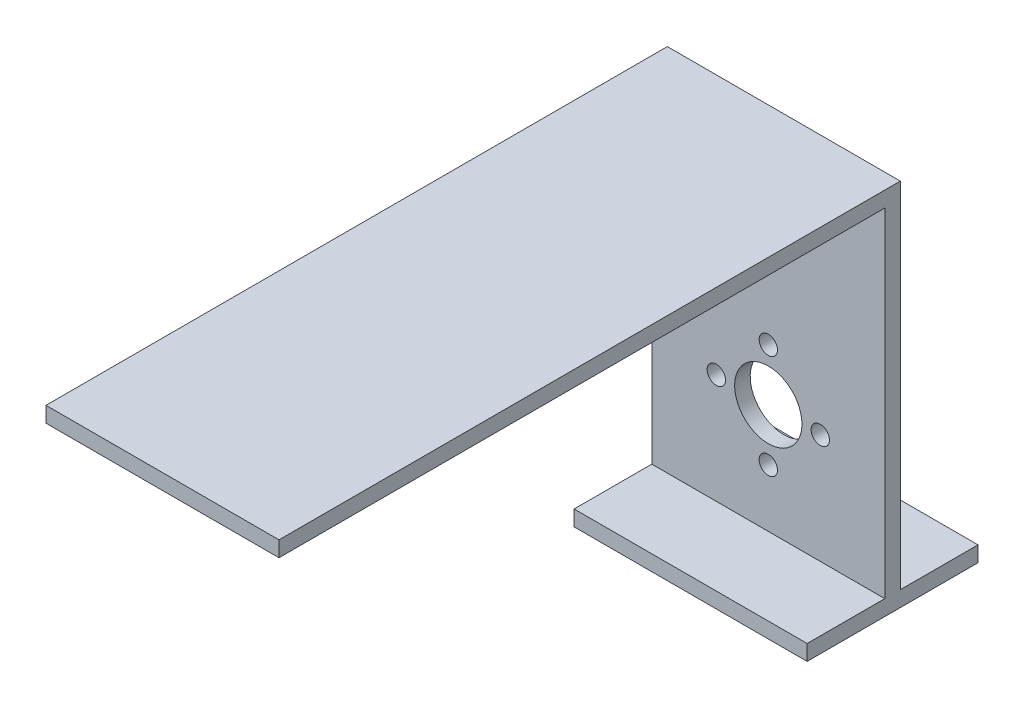
ISO-10303-21;
HEADER;
FILE_DESCRIPTION(('STEP AP214'),'2;1');
FILE_NAME('part.step','',(''),(''),'','','');
FILE_SCHEMA(('AUTOMOTIVE_DESIGN { 1 0 10303 214 1 1 1 1 }'));
ENDSEC;
DATA;
#1=APPLICATION_CONTEXT('core data for automotive mechanical design processes');
#2=APPLICATION_PROTOCOL_DEFINITION('international standard','automotive_design',2000,#1);
#3=PRODUCT_CONTEXT('',#1,'mechanical');
#4=PRODUCT('Part','Part','',(#3));
#5=PRODUCT_RELATED_PRODUCT_CATEGORY('part','',(#4));
#6=PRODUCT_DEFINITION_FORMATION('','',#4);
#7=PRODUCT_DEFINITION_CONTEXT('part definition',#1,'design');
#8=PRODUCT_DEFINITION('design','',#6,#7);
#9=PRODUCT_DEFINITION_SHAPE('','',#8);
#10=(LENGTH_UNIT() NAMED_UNIT(*) SI_UNIT(.MILLI.,.METRE.));
#11=(NAMED_UNIT(*) PLANE_ANGLE_UNIT() SI_UNIT($,.RADIAN.));
#12=(NAMED_UNIT(*) SI_UNIT($,.STERADIAN.) SOLID_ANGLE_UNIT());
#13=UNCERTAINTY_MEASURE_WITH_UNIT(LENGTH_MEASURE(1.E-05),#10,'distance_accuracy_value','');
#14=(GEOMETRIC_REPRESENTATION_CONTEXT(3) GLOBAL_UNCERTAINTY_ASSIGNED_CONTEXT((#13)) GLOBAL_UNIT_ASSIGNED_CONTEXT((#10,
#11,#12)) REPRESENTATION_CONTEXT('',''));
#15=CARTESIAN_POINT('',(0.,0.,0.));
#16=DIRECTION('',(0.,0.,1.));
#17=DIRECTION('',(1.,0.,0.));
#18=AXIS2_PLACEMENT_3D('',#15,#16,#17);
#19=CARTESIAN_POINT('',(38.1,57.86,99.06));
#20=DIRECTION('',(0.,-1.,0.));
#21=DIRECTION('',(0.,0.,-1.));
#22=AXIS2_PLACEMENT_3D('',#19,#20,#21);
#23=PLANE('',#22);
#24=DIRECTION('',(0.,0.,1.));
#25=VECTOR('',#24,1.);
#26=CARTESIAN_POINT('',(0.,57.86,99.06));
#27=LINE('',#26,#25);
#28=CARTESIAN_POINT('',(0.,57.86,-2.53999999999999));
#29=VERTEX_POINT('',#28);
#30=CARTESIAN_POINT('',(0.,57.86,99.06));
#31=VERTEX_POINT('',#30);
#32=EDGE_CURVE('E153',#29,#31,#27,.T.);
#33=ORIENTED_EDGE('',*,*,#32,.T.);
#34=DIRECTION('',(-1.,0.,0.));
#35=VECTOR('',#34,1.);
#36=CARTESIAN_POINT('',(38.1,57.86,99.06));
#37=LINE('',#36,#35);
#38=CARTESIAN_POINT('',(38.1,57.86,99.06));
#39=VERTEX_POINT('',#38);
#40=EDGE_CURVE('E13',#39,#31,#37,.T.);
#41=ORIENTED_EDGE('',*,*,#40,.F.);
#42=DIRECTION('',(0.,0.,1.));
#43=VECTOR('',#42,1.);
#44=CARTESIAN_POINT('',(38.1,57.86,99.06));
#45=LINE('',#44,#43);
#46=CARTESIAN_POINT('',(38.1,57.86,-2.53999999999999));
#47=VERTEX_POINT('',#46);
#48=EDGE_CURVE('E172',#47,#39,#45,.T.);
#49=ORIENTED_EDGE('',*,*,#48,.F.);
#50=DIRECTION('',(-1.,0.,0.));
#51=VECTOR('',#50,1.);
#52=CARTESIAN_POINT('',(38.1,57.86,-2.53999999999999));
#53=LINE('',#52,#51);
#54=EDGE_CURVE('E149',#47,#29,#53,.T.);
#55=ORIENTED_EDGE('',*,*,#54,.T.);
#56=EDGE_LOOP('',(#33,#41,#49,#55));
#57=FACE_BOUND('',#56,.T.);
#58=ADVANCED_FACE('F45',(#57),#23,.F.);
#59=CARTESIAN_POINT('',(38.1,57.86,99.06));
#60=DIRECTION('',(0.,0.,-1.));
#61=DIRECTION('',(0.,1.,0.));
#62=AXIS2_PLACEMENT_3D('',#59,#60,#61);
#63=PLANE('',#62);
#64=DIRECTION('',(0.,-1.,0.));
#65=VECTOR('',#64,1.);
#66=CARTESIAN_POINT('',(0.,57.86,99.06));
#67=LINE('',#66,#65);
#68=CARTESIAN_POINT('',(0.,55.32,99.06));
#69=VERTEX_POINT('',#68);
#70=EDGE_CURVE('E156',#31,#69,#67,.T.);
#71=ORIENTED_EDGE('',*,*,#70,.T.);
#72=DIRECTION('',(-1.,0.,0.));
#73=VECTOR('',#72,1.);
#74=CARTESIAN_POINT('',(38.1,55.32,99.06));
#75=LINE('',#74,#73);
#76=CARTESIAN_POINT('',(38.1,55.32,99.06));
#77=VERTEX_POINT('',#76);
#78=EDGE_CURVE('E53',#77,#69,#75,.T.);
#79=ORIENTED_EDGE('',*,*,#78,.F.);
#80=DIRECTION('',(0.,-1.,0.));
#81=VECTOR('',#80,1.);
#82=CARTESIAN_POINT('',(38.1,57.86,99.06));
#83=LINE('',#82,#81);
#84=EDGE_CURVE('E110',#39,#77,#83,.T.);
#85=ORIENTED_EDGE('',*,*,#84,.F.);
#86=ORIENTED_EDGE('',*,*,#40,.T.);
#87=EDGE_LOOP('',(#71,#79,#85,#86));
#88=FACE_BOUND('',#87,.T.);
#89=ADVANCED_FACE('F284',(#88),#63,.F.);
#90=CARTESIAN_POINT('',(38.1,55.32,99.06));
#91=DIRECTION('',(0.,1.,0.));
#92=DIRECTION('',(0.,0.,1.));
#93=AXIS2_PLACEMENT_3D('',#90,#91,#92);
#94=PLANE('',#93);
#95=DIRECTION('',(0.,0.,-1.));
#96=VECTOR('',#95,1.);
#97=CARTESIAN_POINT('',(0.,55.32,99.06));
#98=LINE('',#97,#96);
#99=CARTESIAN_POINT('',(0.,55.32,0.));
#100=VERTEX_POINT('',#99);
#101=EDGE_CURVE('E159',#69,#100,#98,.T.);
#102=ORIENTED_EDGE('',*,*,#101,.T.);
#103=DIRECTION('',(-1.,0.,0.));
#104=VECTOR('',#103,1.);
#105=CARTESIAN_POINT('',(38.1,55.32,0.));
#106=LINE('',#105,#104);
#107=CARTESIAN_POINT('',(38.1,55.32,0.));
#108=VERTEX_POINT('',#107);
#109=EDGE_CURVE('E185',#108,#100,#106,.T.);
#110=ORIENTED_EDGE('',*,*,#109,.F.);
#111=DIRECTION('',(0.,0.,-1.));
#112=VECTOR('',#111,1.);
#113=CARTESIAN_POINT('',(38.1,55.32,99.06));
#114=LINE('',#113,#112);
#115=EDGE_CURVE('E193',#77,#108,#114,.T.);
#116=ORIENTED_EDGE('',*,*,#115,.F.);
#117=ORIENTED_EDGE('',*,*,#78,.T.);
#118=EDGE_LOOP('',(#102,#110,#116,#117));
#119=FACE_BOUND('',#118,.T.);
#120=ADVANCED_FACE('F191',(#119),#94,.F.);
#121=CARTESIAN_POINT('',(38.1,55.32,0.));
#122=DIRECTION('',(0.,0.,-1.));
#123=DIRECTION('',(-1.,0.,0.));
#124=AXIS2_PLACEMENT_3D('',#121,#122,#123);
#125=PLANE('',#124);
#126=CARTESIAN_POINT('',(19.05,26.42,0.));
#127=DIRECTION('',(0.,0.,1.));
#128=DIRECTION('',(1.,0.,0.));
#129=AXIS2_PLACEMENT_3D('',#126,#127,#128);
#130=CIRCLE('',#129,1.5);
#131=CARTESIAN_POINT('',(20.55,26.42,0.));
#132=VERTEX_POINT('',#131);
#133=EDGE_CURVE('E230',#132,#132,#130,.T.);
#134=ORIENTED_EDGE('',*,*,#133,.F.);
#135=EDGE_LOOP('',(#134));
#136=FACE_BOUND('',#135,.T.);
#137=CARTESIAN_POINT('',(19.05,17.92,0.));
#138=DIRECTION('',(0.,0.,1.));
#139=DIRECTION('',(1.,0.,0.));
#140=AXIS2_PLACEMENT_3D('',#137,#138,#139);
#141=CIRCLE('',#140,5.5);
#142=CARTESIAN_POINT('',(24.55,17.92,0.));
#143=VERTEX_POINT('',#142);
#144=EDGE_CURVE('E237',#143,#143,#141,.T.);
#145=ORIENTED_EDGE('',*,*,#144,.F.);
#146=EDGE_LOOP('',(#145));
#147=FACE_BOUND('',#146,.T.);
#148=CARTESIAN_POINT('',(10.55,17.92,0.));
#149=DIRECTION('',(0.,0.,1.));
#150=DIRECTION('',(1.,0.,0.));
#151=AXIS2_PLACEMENT_3D('',#148,#149,#150);
#152=CIRCLE('',#151,1.5);
#153=CARTESIAN_POINT('',(12.05,17.92,0.));
#154=VERTEX_POINT('',#153);
#155=EDGE_CURVE('E236',#154,#154,#152,.T.);
#156=ORIENTED_EDGE('',*,*,#155,.F.);
#157=EDGE_LOOP('',(#156));
#158=FACE_BOUND('',#157,.T.);
#159=CARTESIAN_POINT('',(27.55,17.92,0.));
#160=DIRECTION('',(0.,0.,1.));
#161=DIRECTION('',(1.,0.,0.));
#162=AXIS2_PLACEMENT_3D('',#159,#160,#161);
#163=CIRCLE('',#162,1.5);
#164=CARTESIAN_POINT('',(29.05,17.92,0.));
#165=VERTEX_POINT('',#164);
#166=EDGE_CURVE('E223',#165,#165,#163,.T.);
#167=ORIENTED_EDGE('',*,*,#166,.F.);
#168=EDGE_LOOP('',(#167));
#169=FACE_BOUND('',#168,.T.);
#170=CARTESIAN_POINT('',(19.05,9.42,0.));
#171=DIRECTION('',(0.,0.,1.));
#172=DIRECTION('',(1.,0.,0.));
#173=AXIS2_PLACEMENT_3D('',#170,#171,#172);
#174=CIRCLE('',#173,1.5);
#175=CARTESIAN_POINT('',(20.55,9.42,0.));
#176=VERTEX_POINT('',#175);
#177=EDGE_CURVE('E222',#176,#176,#174,.T.);
#178=ORIENTED_EDGE('',*,*,#177,.F.);
#179=EDGE_LOOP('',(#178));
#180=FACE_BOUND('',#179,.T.);
#181=DIRECTION('',(0.,-1.,0.));
#182=VECTOR('',#181,1.);
#183=CARTESIAN_POINT('',(0.,55.32,0.));
#184=LINE('',#183,#182);
#185=CARTESIAN_POINT('',(0.,0.,0.));
#186=VERTEX_POINT('',#185);
#187=EDGE_CURVE('E161',#100,#186,#184,.T.);
#188=ORIENTED_EDGE('',*,*,#187,.T.);
#189=DIRECTION('',(-1.,0.,0.));
#190=VECTOR('',#189,1.);
#191=CARTESIAN_POINT('',(38.1,0.,0.));
#192=LINE('',#191,#190);
#193=CARTESIAN_POINT('',(38.1,0.,0.));
#194=VERTEX_POINT('',#193);
#195=EDGE_CURVE('E182',#194,#186,#192,.T.);
#196=ORIENTED_EDGE('',*,*,#195,.F.);
#197=DIRECTION('',(0.,-1.,0.));
#198=VECTOR('',#197,1.);
#199=CARTESIAN_POINT('',(38.1,55.32,0.));
#200=LINE('',#199,#198);
#201=EDGE_CURVE('E211',#108,#194,#200,.T.);
#202=ORIENTED_EDGE('',*,*,#201,.F.);
#203=ORIENTED_EDGE('',*,*,#109,.T.);
#204=EDGE_LOOP('',(#188,#196,#202,#203));
#205=FACE_BOUND('',#204,.T.);
#206=ADVANCED_FACE('F202',(#136,#147,#158,#169,#180,#205),#125,.F.);
#207=CARTESIAN_POINT('',(38.1,0.,0.));
#208=DIRECTION('',(0.,-1.,0.));
#209=DIRECTION('',(0.,0.,-1.));
#210=AXIS2_PLACEMENT_3D('',#207,#208,#209);
#211=PLANE('',#210);
#212=DIRECTION('',(0.,0.,1.));
#213=VECTOR('',#212,1.);
#214=CARTESIAN_POINT('',(0.,0.,0.));
#215=LINE('',#214,#213);
#216=CARTESIAN_POINT('',(0.,0.,12.7));
#217=VERTEX_POINT('',#216);
#218=EDGE_CURVE('E163',#186,#217,#215,.T.);
#219=ORIENTED_EDGE('',*,*,#218,.T.);
#220=DIRECTION('',(-1.,0.,0.));
#221=VECTOR('',#220,1.);
#222=CARTESIAN_POINT('',(38.1,0.,12.7));
#223=LINE('',#222,#221);
#224=CARTESIAN_POINT('',(38.1,0.,12.7));
#225=VERTEX_POINT('',#224);
#226=EDGE_CURVE('E179',#225,#217,#223,.T.);
#227=ORIENTED_EDGE('',*,*,#226,.F.);
#228=DIRECTION('',(0.,0.,1.));
#229=VECTOR('',#228,1.);
#230=CARTESIAN_POINT('',(38.1,0.,0.));
#231=LINE('',#230,#229);
#232=EDGE_CURVE('E208',#194,#225,#231,.T.);
#233=ORIENTED_EDGE('',*,*,#232,.F.);
#234=ORIENTED_EDGE('',*,*,#195,.T.);
#235=EDGE_LOOP('',(#219,#227,#233,#234));
#236=FACE_BOUND('',#235,.T.);
#237=ADVANCED_FACE('F206',(#236),#211,.F.);
#238=CARTESIAN_POINT('',(38.1,0.,12.7));
#239=DIRECTION('',(0.,0.,-1.));
#240=DIRECTION('',(-1.,0.,0.));
#241=AXIS2_PLACEMENT_3D('',#238,#239,#240);
#242=PLANE('',#241);
#243=DIRECTION('',(0.,-1.,0.));
#244=VECTOR('',#243,1.);
#245=CARTESIAN_POINT('',(0.,0.,12.7));
#246=LINE('',#245,#244);
#247=CARTESIAN_POINT('',(0.,-2.54,12.7));
#248=VERTEX_POINT('',#247);
#249=EDGE_CURVE('E165',#217,#248,#246,.T.);
#250=ORIENTED_EDGE('',*,*,#249,.T.);
#251=DIRECTION('',(-1.,0.,0.));
#252=VECTOR('',#251,1.);
#253=CARTESIAN_POINT('',(38.1,-2.54,12.7));
#254=LINE('',#253,#252);
#255=CARTESIAN_POINT('',(38.1,-2.54,12.7));
#256=VERTEX_POINT('',#255);
#257=EDGE_CURVE('E176',#256,#248,#254,.T.);
#258=ORIENTED_EDGE('',*,*,#257,.F.);
#259=DIRECTION('',(0.,-1.,0.));
#260=VECTOR('',#259,1.);
#261=CARTESIAN_POINT('',(38.1,0.,12.7));
#262=LINE('',#261,#260);
#263=EDGE_CURVE('E210',#225,#256,#262,.T.);
#264=ORIENTED_EDGE('',*,*,#263,.F.);
#265=ORIENTED_EDGE('',*,*,#226,.T.);
#266=EDGE_LOOP('',(#250,#258,#264,#265));
#267=FACE_BOUND('',#266,.T.);
#268=ADVANCED_FACE('F296',(#267),#242,.F.);
#269=CARTESIAN_POINT('',(38.1,-2.54,12.7));
#270=DIRECTION('',(0.,1.,0.));
#271=DIRECTION('',(0.,0.,1.));
#272=AXIS2_PLACEMENT_3D('',#269,#270,#271);
#273=PLANE('',#272);
#274=DIRECTION('',(0.,0.,-1.));
#275=VECTOR('',#274,1.);
#276=CARTESIAN_POINT('',(0.,-2.54,12.7));
#277=LINE('',#276,#275);
#278=CARTESIAN_POINT('',(0.,-2.54,-15.24));
#279=VERTEX_POINT('',#278);
#280=EDGE_CURVE('E167',#248,#279,#277,.T.);
#281=ORIENTED_EDGE('',*,*,#280,.T.);
#282=DIRECTION('',(-1.,0.,0.));
#283=VECTOR('',#282,1.);
#284=CARTESIAN_POINT('',(38.1,-2.54,-15.24));
#285=LINE('',#284,#283);
#286=CARTESIAN_POINT('',(38.1,-2.54,-15.24));
#287=VERTEX_POINT('',#286);
#288=EDGE_CURVE('E144',#287,#279,#285,.T.);
#289=ORIENTED_EDGE('',*,*,#288,.F.);
#290=DIRECTION('',(0.,0.,-1.));
#291=VECTOR('',#290,1.);
#292=CARTESIAN_POINT('',(38.1,-2.54,12.7));
#293=LINE('',#292,#291);
#294=EDGE_CURVE('E135',#256,#287,#293,.T.);
#295=ORIENTED_EDGE('',*,*,#294,.F.);
#296=ORIENTED_EDGE('',*,*,#257,.T.);
#297=EDGE_LOOP('',(#281,#289,#295,#296));
#298=FACE_BOUND('',#297,.T.);
#299=ADVANCED_FACE('F293',(#298),#273,.F.);
#300=CARTESIAN_POINT('',(38.1,-2.54,-15.24));
#301=DIRECTION('',(0.,0.,1.));
#302=DIRECTION('',(1.,0.,0.));
#303=AXIS2_PLACEMENT_3D('',#300,#301,#302);
#304=PLANE('',#303);
#305=DIRECTION('',(0.,1.,0.));
#306=VECTOR('',#305,1.);
#307=CARTESIAN_POINT('',(0.,-2.54,-15.24));
#308=LINE('',#307,#306);
#309=CARTESIAN_POINT('',(0.,0.,-15.24));
#310=VERTEX_POINT('',#309);
#311=EDGE_CURVE('E143',#279,#310,#308,.T.);
#312=ORIENTED_EDGE('',*,*,#311,.T.);
#313=DIRECTION('',(-1.,0.,0.));
#314=VECTOR('',#313,1.);
#315=CARTESIAN_POINT('',(38.1,0.,-15.24));
#316=LINE('',#315,#314);
#317=CARTESIAN_POINT('',(38.1,0.,-15.24));
#318=VERTEX_POINT('',#317);
#319=EDGE_CURVE('E140',#318,#310,#316,.T.);
#320=ORIENTED_EDGE('',*,*,#319,.F.);
#321=DIRECTION('',(0.,1.,0.));
#322=VECTOR('',#321,1.);
#323=CARTESIAN_POINT('',(38.1,-2.54,-15.24));
#324=LINE('',#323,#322);
#325=EDGE_CURVE('E129',#287,#318,#324,.T.);
#326=ORIENTED_EDGE('',*,*,#325,.F.);
#327=ORIENTED_EDGE('',*,*,#288,.T.);
#328=EDGE_LOOP('',(#312,#320,#326,#327));
#329=FACE_BOUND('',#328,.T.);
#330=ADVANCED_FACE('F141',(#329),#304,.F.);
#331=CARTESIAN_POINT('',(38.1,0.,-15.24));
#332=DIRECTION('',(0.,-1.,0.));
#333=DIRECTION('',(0.,0.,-1.));
#334=AXIS2_PLACEMENT_3D('',#331,#332,#333);
#335=PLANE('',#334);
#336=DIRECTION('',(0.,0.,1.));
#337=VECTOR('',#336,1.);
#338=CARTESIAN_POINT('',(0.,0.,-15.24));
#339=LINE('',#338,#337);
#340=CARTESIAN_POINT('',(0.,0.,-2.54));
#341=VERTEX_POINT('',#340);
#342=EDGE_CURVE('E96',#310,#341,#339,.T.);
#343=ORIENTED_EDGE('',*,*,#342,.T.);
#344=DIRECTION('',(-1.,0.,0.));
#345=VECTOR('',#344,1.);
#346=CARTESIAN_POINT('',(38.1,0.,-2.54));
#347=LINE('',#346,#345);
#348=CARTESIAN_POINT('',(38.1,0.,-2.54));
#349=VERTEX_POINT('',#348);
#350=EDGE_CURVE('E145',#349,#341,#347,.T.);
#351=ORIENTED_EDGE('',*,*,#350,.F.);
#352=DIRECTION('',(0.,0.,1.));
#353=VECTOR('',#352,1.);
#354=CARTESIAN_POINT('',(38.1,0.,-15.24));
#355=LINE('',#354,#353);
#356=EDGE_CURVE('E133',#318,#349,#355,.T.);
#357=ORIENTED_EDGE('',*,*,#356,.F.);
#358=ORIENTED_EDGE('',*,*,#319,.T.);
#359=EDGE_LOOP('',(#343,#351,#357,#358));
#360=FACE_BOUND('',#359,.T.);
#361=ADVANCED_FACE('F147',(#360),#335,.F.);
#362=CARTESIAN_POINT('',(38.1,57.86,-2.53999999999999));
#363=DIRECTION('',(0.,0.,1.));
#364=DIRECTION('',(0.,-1.,0.));
#365=AXIS2_PLACEMENT_3D('',#362,#363,#364);
#366=PLANE('',#365);
#367=CARTESIAN_POINT('',(19.05,26.42,-2.53999999999999));
#368=DIRECTION('',(0.,0.,1.));
#369=DIRECTION('',(0.,-1.,0.));
#370=AXIS2_PLACEMENT_3D('',#367,#368,#369);
#371=CIRCLE('',#370,1.5);
#372=CARTESIAN_POINT('',(19.05,24.92,-2.53999999999999));
#373=VERTEX_POINT('',#372);
#374=EDGE_CURVE('E157',#373,#373,#371,.F.);
#375=ORIENTED_EDGE('',*,*,#374,.F.);
#376=EDGE_LOOP('',(#375));
#377=FACE_BOUND('',#376,.T.);
#378=CARTESIAN_POINT('',(19.05,17.92,-2.54));
#379=DIRECTION('',(0.,0.,1.));
#380=DIRECTION('',(0.,-1.,0.));
#381=AXIS2_PLACEMENT_3D('',#378,#379,#380);
#382=CIRCLE('',#381,5.5);
#383=CARTESIAN_POINT('',(19.05,12.42,-2.54));
#384=VERTEX_POINT('',#383);
#385=EDGE_CURVE('E233',#384,#384,#382,.F.);
#386=ORIENTED_EDGE('',*,*,#385,.F.);
#387=EDGE_LOOP('',(#386));
#388=FACE_BOUND('',#387,.T.);
#389=CARTESIAN_POINT('',(10.55,17.92,-2.54));
#390=DIRECTION('',(0.,0.,1.));
#391=DIRECTION('',(0.,-1.,0.));
#392=AXIS2_PLACEMENT_3D('',#389,#390,#391);
#393=CIRCLE('',#392,1.5);
#394=CARTESIAN_POINT('',(10.55,16.42,-2.54));
#395=VERTEX_POINT('',#394);
#396=EDGE_CURVE('E226',#395,#395,#393,.F.);
#397=ORIENTED_EDGE('',*,*,#396,.F.);
#398=EDGE_LOOP('',(#397));
#399=FACE_BOUND('',#398,.T.);
#400=CARTESIAN_POINT('',(27.55,17.92,-2.54));
#401=DIRECTION('',(0.,0.,1.));
#402=DIRECTION('',(0.,-1.,0.));
#403=AXIS2_PLACEMENT_3D('',#400,#401,#402);
#404=CIRCLE('',#403,1.5);
#405=CARTESIAN_POINT('',(27.55,16.42,-2.54));
#406=VERTEX_POINT('',#405);
#407=EDGE_CURVE('E219',#406,#406,#404,.F.);
#408=ORIENTED_EDGE('',*,*,#407,.F.);
#409=EDGE_LOOP('',(#408));
#410=FACE_BOUND('',#409,.T.);
#411=CARTESIAN_POINT('',(19.05,9.42,-2.54));
#412=DIRECTION('',(0.,0.,1.));
#413=DIRECTION('',(0.,-1.,0.));
#414=AXIS2_PLACEMENT_3D('',#411,#412,#413);
#415=CIRCLE('',#414,1.5);
#416=CARTESIAN_POINT('',(19.05,7.92,-2.54));
#417=VERTEX_POINT('',#416);
#418=EDGE_CURVE('E227',#417,#417,#415,.F.);
#419=ORIENTED_EDGE('',*,*,#418,.F.);
#420=EDGE_LOOP('',(#419));
#421=FACE_BOUND('',#420,.T.);
#422=DIRECTION('',(0.,1.,0.));
#423=VECTOR('',#422,1.);
#424=CARTESIAN_POINT('',(0.,57.86,-2.53999999999999));
#425=LINE('',#424,#423);
#426=EDGE_CURVE('E102',#341,#29,#425,.T.);
#427=ORIENTED_EDGE('',*,*,#426,.T.);
#428=ORIENTED_EDGE('',*,*,#54,.F.);
#429=DIRECTION('',(0.,1.,0.));
#430=VECTOR('',#429,1.);
#431=CARTESIAN_POINT('',(38.1,57.86,-2.53999999999999));
#432=LINE('',#431,#430);
#433=EDGE_CURVE('E61',#349,#47,#432,.T.);
#434=ORIENTED_EDGE('',*,*,#433,.F.);
#435=ORIENTED_EDGE('',*,*,#350,.T.);
#436=EDGE_LOOP('',(#427,#428,#434,#435));
#437=FACE_BOUND('',#436,.T.);
#438=ADVANCED_FACE('F270',(#377,#388,#399,#410,#421,#437),#366,.F.);
#439=CARTESIAN_POINT('',(38.1,0.,0.));
#440=DIRECTION('',(-1.,0.,0.));
#441=DIRECTION('',(0.,0.,1.));
#442=AXIS2_PLACEMENT_3D('',#439,#440,#441);
#443=PLANE('',#442);
#444=ORIENTED_EDGE('',*,*,#48,.T.);
#445=ORIENTED_EDGE('',*,*,#84,.T.);
#446=ORIENTED_EDGE('',*,*,#115,.T.);
#447=ORIENTED_EDGE('',*,*,#201,.T.);
#448=ORIENTED_EDGE('',*,*,#232,.T.);
#449=ORIENTED_EDGE('',*,*,#263,.T.);
#450=ORIENTED_EDGE('',*,*,#294,.T.);
#451=ORIENTED_EDGE('',*,*,#325,.T.);
#452=ORIENTED_EDGE('',*,*,#356,.T.);
#453=ORIENTED_EDGE('',*,*,#433,.T.);
#454=EDGE_LOOP('',(#444,#445,#446,#447,#448,#449,#450,#451,#452,#453));
#455=FACE_BOUND('',#454,.T.);
#456=ADVANCED_FACE('F131',(#455),#443,.F.);
#457=CARTESIAN_POINT('',(0.,0.,0.));
#458=DIRECTION('',(-1.,0.,0.));
#459=DIRECTION('',(0.,0.,1.));
#460=AXIS2_PLACEMENT_3D('',#457,#458,#459);
#461=PLANE('',#460);
#462=ORIENTED_EDGE('',*,*,#32,.F.);
#463=ORIENTED_EDGE('',*,*,#426,.F.);
#464=ORIENTED_EDGE('',*,*,#342,.F.);
#465=ORIENTED_EDGE('',*,*,#311,.F.);
#466=ORIENTED_EDGE('',*,*,#280,.F.);
#467=ORIENTED_EDGE('',*,*,#249,.F.);
#468=ORIENTED_EDGE('',*,*,#218,.F.);
#469=ORIENTED_EDGE('',*,*,#187,.F.);
#470=ORIENTED_EDGE('',*,*,#101,.F.);
#471=ORIENTED_EDGE('',*,*,#70,.F.);
#472=EDGE_LOOP('',(#462,#463,#464,#465,#466,#467,#468,#469,#470,#471));
#473=FACE_BOUND('',#472,.T.);
#474=ADVANCED_FACE('F197',(#473),#461,.T.);
#475=CARTESIAN_POINT('',(19.05,9.42,-15.241));
#476=DIRECTION('',(0.,0.,1.));
#477=DIRECTION('',(1.,0.,0.));
#478=AXIS2_PLACEMENT_3D('',#475,#476,#477);
#479=CYLINDRICAL_SURFACE('',#478,1.5);
#480=ORIENTED_EDGE('',*,*,#177,.T.);
#481=EDGE_LOOP('',(#480));
#482=FACE_BOUND('',#481,.T.);
#483=ORIENTED_EDGE('',*,*,#418,.T.);
#484=EDGE_LOOP('',(#483));
#485=FACE_BOUND('',#484,.T.);
#486=ADVANCED_FACE('F263',(#482,#485),#479,.F.);
#487=CARTESIAN_POINT('',(27.55,17.92,-15.241));
#488=DIRECTION('',(0.,0.,1.));
#489=DIRECTION('',(1.,0.,0.));
#490=AXIS2_PLACEMENT_3D('',#487,#488,#489);
#491=CYLINDRICAL_SURFACE('',#490,1.5);
#492=ORIENTED_EDGE('',*,*,#166,.T.);
#493=EDGE_LOOP('',(#492));
#494=FACE_BOUND('',#493,.T.);
#495=ORIENTED_EDGE('',*,*,#407,.T.);
#496=EDGE_LOOP('',(#495));
#497=FACE_BOUND('',#496,.T.);
#498=ADVANCED_FACE('F266',(#494,#497),#491,.F.);
#499=CARTESIAN_POINT('',(10.55,17.92,-15.241));
#500=DIRECTION('',(0.,0.,1.));
#501=DIRECTION('',(1.,0.,0.));
#502=AXIS2_PLACEMENT_3D('',#499,#500,#501);
#503=CYLINDRICAL_SURFACE('',#502,1.5);
#504=ORIENTED_EDGE('',*,*,#155,.T.);
#505=EDGE_LOOP('',(#504));
#506=FACE_BOUND('',#505,.T.);
#507=ORIENTED_EDGE('',*,*,#396,.T.);
#508=EDGE_LOOP('',(#507));
#509=FACE_BOUND('',#508,.T.);
#510=ADVANCED_FACE('F369',(#506,#509),#503,.F.);
#511=CARTESIAN_POINT('',(19.05,17.92,-15.241));
#512=DIRECTION('',(0.,0.,1.));
#513=DIRECTION('',(1.,0.,0.));
#514=AXIS2_PLACEMENT_3D('',#511,#512,#513);
#515=CYLINDRICAL_SURFACE('',#514,5.5);
#516=ORIENTED_EDGE('',*,*,#144,.T.);
#517=EDGE_LOOP('',(#516));
#518=FACE_BOUND('',#517,.T.);
#519=ORIENTED_EDGE('',*,*,#385,.T.);
#520=EDGE_LOOP('',(#519));
#521=FACE_BOUND('',#520,.T.);
#522=ADVANCED_FACE('F377',(#518,#521),#515,.F.);
#523=CARTESIAN_POINT('',(19.05,26.42,-15.241));
#524=DIRECTION('',(0.,0.,1.));
#525=DIRECTION('',(1.,0.,0.));
#526=AXIS2_PLACEMENT_3D('',#523,#524,#525);
#527=CYLINDRICAL_SURFACE('',#526,1.5);
#528=ORIENTED_EDGE('',*,*,#133,.T.);
#529=EDGE_LOOP('',(#528));
#530=FACE_BOUND('',#529,.T.);
#531=ORIENTED_EDGE('',*,*,#374,.T.);
#532=EDGE_LOOP('',(#531));
#533=FACE_BOUND('',#532,.T.);
#534=ADVANCED_FACE('F249',(#530,#533),#527,.F.);
#535=CLOSED_SHELL('',(#58,#89,#120,#206,#237,#268,#299,#330,#361,#438,#456,#474,#486,#498,#510,
#522,#534));
#536=MANIFOLD_SOLID_BREP('B2',#535);
#537=ADVANCED_BREP_SHAPE_REPRESENTATION('',(#18,#536),#14);
#538=SHAPE_DEFINITION_REPRESENTATION(#9,#537);
ENDSEC;
END-ISO-10303-21;
